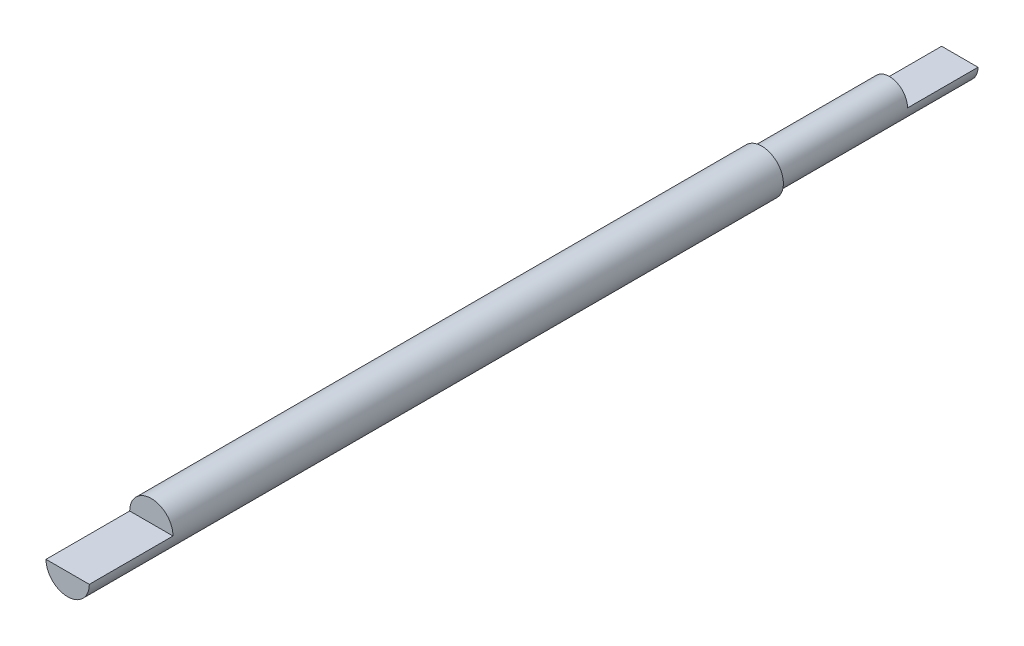
ISO-10303-21;
HEADER;
FILE_DESCRIPTION(('STEP AP214'),'2;1');
FILE_NAME('part.step','',(''),(''),'','','');
FILE_SCHEMA(('AUTOMOTIVE_DESIGN { 1 0 10303 214 1 1 1 1 }'));
ENDSEC;
DATA;
#1=APPLICATION_CONTEXT('core data for automotive mechanical design processes');
#2=APPLICATION_PROTOCOL_DEFINITION('international standard','automotive_design',2000,#1);
#3=PRODUCT_CONTEXT('',#1,'mechanical');
#4=PRODUCT('Part','Part','',(#3));
#5=PRODUCT_RELATED_PRODUCT_CATEGORY('part','',(#4));
#6=PRODUCT_DEFINITION_FORMATION('','',#4);
#7=PRODUCT_DEFINITION_CONTEXT('part definition',#1,'design');
#8=PRODUCT_DEFINITION('design','',#6,#7);
#9=PRODUCT_DEFINITION_SHAPE('','',#8);
#10=(LENGTH_UNIT() NAMED_UNIT(*) SI_UNIT(.MILLI.,.METRE.));
#11=(NAMED_UNIT(*) PLANE_ANGLE_UNIT() SI_UNIT($,.RADIAN.));
#12=(NAMED_UNIT(*) SI_UNIT($,.STERADIAN.) SOLID_ANGLE_UNIT());
#13=UNCERTAINTY_MEASURE_WITH_UNIT(LENGTH_MEASURE(1.E-05),#10,'distance_accuracy_value','');
#14=(GEOMETRIC_REPRESENTATION_CONTEXT(3) GLOBAL_UNCERTAINTY_ASSIGNED_CONTEXT((#13)) GLOBAL_UNIT_ASSIGNED_CONTEXT((#10,
#11,#12)) REPRESENTATION_CONTEXT('',''));
#15=CARTESIAN_POINT('',(0.,0.,0.));
#16=DIRECTION('',(0.,0.,1.));
#17=DIRECTION('',(1.,0.,0.));
#18=AXIS2_PLACEMENT_3D('',#15,#16,#17);
#19=CARTESIAN_POINT('',(0.,0.,196.25));
#20=DIRECTION('',(0.,0.,-1.));
#21=DIRECTION('',(-1.,0.,0.));
#22=AXIS2_PLACEMENT_3D('',#19,#20,#21);
#23=CYLINDRICAL_SURFACE('',#22,4.7625);
#24=CARTESIAN_POINT('',(0.,0.,196.25));
#25=DIRECTION('',(0.,0.,1.));
#26=DIRECTION('',(1.,0.,0.));
#27=AXIS2_PLACEMENT_3D('',#24,#25,#26);
#28=CIRCLE('',#27,4.7625);
#29=CARTESIAN_POINT('',(-4.7625,0.,196.25));
#30=VERTEX_POINT('',#29);
#31=CARTESIAN_POINT('',(4.7625,0.,196.25));
#32=VERTEX_POINT('',#31);
#33=EDGE_CURVE('E11',#30,#32,#28,.T.);
#34=ORIENTED_EDGE('',*,*,#33,.F.);
#35=DIRECTION('',(0.,0.,1.));
#36=VECTOR('',#35,1.);
#37=CARTESIAN_POINT('',(-4.7625,0.,177.84));
#38=LINE('',#37,#36);
#39=CARTESIAN_POINT('',(-4.7625,0.,177.84));
#40=VERTEX_POINT('',#39);
#41=EDGE_CURVE('E57',#40,#30,#38,.T.);
#42=ORIENTED_EDGE('',*,*,#41,.F.);
#43=CARTESIAN_POINT('',(0.,0.,177.84));
#44=DIRECTION('',(0.,0.,1.));
#45=DIRECTION('',(1.,0.,0.));
#46=AXIS2_PLACEMENT_3D('',#43,#44,#45);
#47=CIRCLE('',#46,4.7625);
#48=CARTESIAN_POINT('',(4.7625,0.,177.84));
#49=VERTEX_POINT('',#48);
#50=EDGE_CURVE('E104',#49,#40,#47,.T.);
#51=ORIENTED_EDGE('',*,*,#50,.F.);
#52=DIRECTION('',(0.,0.,1.));
#53=VECTOR('',#52,1.);
#54=CARTESIAN_POINT('',(4.7625,0.,177.84));
#55=LINE('',#54,#53);
#56=EDGE_CURVE('E42',#49,#32,#55,.T.);
#57=ORIENTED_EDGE('',*,*,#56,.T.);
#58=EDGE_LOOP('',(#34,#42,#51,#57));
#59=FACE_BOUND('',#58,.T.);
#60=CARTESIAN_POINT('',(0.,0.,43.57));
#61=DIRECTION('',(0.,0.,-1.));
#62=DIRECTION('',(-1.,0.,0.));
#63=AXIS2_PLACEMENT_3D('',#60,#61,#62);
#64=CIRCLE('',#63,4.7625);
#65=CARTESIAN_POINT('',(-4.7625,0.,43.57));
#66=VERTEX_POINT('',#65);
#67=EDGE_CURVE('E99',#66,#66,#64,.T.);
#68=ORIENTED_EDGE('',*,*,#67,.F.);
#69=EDGE_LOOP('',(#68));
#70=FACE_BOUND('',#69,.T.);
#71=ADVANCED_FACE('F35',(#59,#70),#23,.T.);
#72=CARTESIAN_POINT('',(0.,0.,196.25));
#73=DIRECTION('',(0.,0.,1.));
#74=DIRECTION('',(1.,0.,0.));
#75=AXIS2_PLACEMENT_3D('',#72,#73,#74);
#76=PLANE('',#75);
#77=DIRECTION('',(1.,0.,0.));
#78=VECTOR('',#77,1.);
#79=CARTESIAN_POINT('',(0.,0.,196.25));
#80=LINE('',#79,#78);
#81=EDGE_CURVE('E103',#30,#32,#80,.T.);
#82=ORIENTED_EDGE('',*,*,#81,.F.);
#83=ORIENTED_EDGE('',*,*,#33,.T.);
#84=EDGE_LOOP('',(#82,#83));
#85=FACE_BOUND('',#84,.T.);
#86=ADVANCED_FACE('F116',(#85),#76,.T.);
#87=CARTESIAN_POINT('',(0.,0.,177.84));
#88=DIRECTION('',(0.,-1.,0.));
#89=DIRECTION('',(0.,0.,-1.));
#90=AXIS2_PLACEMENT_3D('',#87,#88,#89);
#91=PLANE('',#90);
#92=ORIENTED_EDGE('',*,*,#81,.T.);
#93=ORIENTED_EDGE('',*,*,#56,.F.);
#94=DIRECTION('',(1.,0.,0.));
#95=VECTOR('',#94,1.);
#96=CARTESIAN_POINT('',(0.,0.,177.84));
#97=LINE('',#96,#95);
#98=EDGE_CURVE('E106',#40,#49,#97,.T.);
#99=ORIENTED_EDGE('',*,*,#98,.F.);
#100=ORIENTED_EDGE('',*,*,#41,.T.);
#101=EDGE_LOOP('',(#92,#93,#99,#100));
#102=FACE_BOUND('',#101,.T.);
#103=ADVANCED_FACE('F117',(#102),#91,.F.);
#104=CARTESIAN_POINT('',(0.,0.,177.84));
#105=DIRECTION('',(0.,0.,1.));
#106=DIRECTION('',(1.,0.,0.));
#107=AXIS2_PLACEMENT_3D('',#104,#105,#106);
#108=PLANE('',#107);
#109=ORIENTED_EDGE('',*,*,#50,.T.);
#110=ORIENTED_EDGE('',*,*,#98,.T.);
#111=EDGE_LOOP('',(#109,#110));
#112=FACE_BOUND('',#111,.T.);
#113=ADVANCED_FACE('F119',(#112),#108,.T.);
#114=CARTESIAN_POINT('',(0.,0.,43.57));
#115=DIRECTION('',(0.,0.,-1.));
#116=DIRECTION('',(-1.,0.,0.));
#117=AXIS2_PLACEMENT_3D('',#114,#115,#116);
#118=PLANE('',#117);
#119=CARTESIAN_POINT('',(0.,0.,43.57));
#120=DIRECTION('',(0.,0.,-1.));
#121=DIRECTION('',(-1.,0.,0.));
#122=AXIS2_PLACEMENT_3D('',#119,#120,#121);
#123=CIRCLE('',#122,4.);
#124=CARTESIAN_POINT('',(-4.,0.,43.57));
#125=VERTEX_POINT('',#124);
#126=EDGE_CURVE('E96',#125,#125,#123,.T.);
#127=ORIENTED_EDGE('',*,*,#126,.F.);
#128=EDGE_LOOP('',(#127));
#129=FACE_BOUND('',#128,.T.);
#130=ORIENTED_EDGE('',*,*,#67,.T.);
#131=EDGE_LOOP('',(#130));
#132=FACE_BOUND('',#131,.T.);
#133=ADVANCED_FACE('F125',(#129,#132),#118,.T.);
#134=CARTESIAN_POINT('',(0.,0.,43.57));
#135=DIRECTION('',(0.,0.,-1.));
#136=DIRECTION('',(-1.,0.,0.));
#137=AXIS2_PLACEMENT_3D('',#134,#135,#136);
#138=CYLINDRICAL_SURFACE('',#137,4.);
#139=DIRECTION('',(0.,0.,-1.));
#140=VECTOR('',#139,1.);
#141=CARTESIAN_POINT('',(-4.,0.,15.5));
#142=LINE('',#141,#140);
#143=CARTESIAN_POINT('',(-4.,0.,15.5));
#144=VERTEX_POINT('',#143);
#145=CARTESIAN_POINT('',(-4.,0.,0.));
#146=VERTEX_POINT('',#145);
#147=EDGE_CURVE('E85',#144,#146,#142,.T.);
#148=ORIENTED_EDGE('',*,*,#147,.T.);
#149=CARTESIAN_POINT('',(0.,0.,0.));
#150=DIRECTION('',(0.,0.,-1.));
#151=DIRECTION('',(-1.,0.,0.));
#152=AXIS2_PLACEMENT_3D('',#149,#150,#151);
#153=CIRCLE('',#152,4.);
#154=CARTESIAN_POINT('',(4.,0.,0.));
#155=VERTEX_POINT('',#154);
#156=EDGE_CURVE('E91',#155,#146,#153,.T.);
#157=ORIENTED_EDGE('',*,*,#156,.F.);
#158=DIRECTION('',(0.,0.,-1.));
#159=VECTOR('',#158,1.);
#160=CARTESIAN_POINT('',(4.,0.,15.5));
#161=LINE('',#160,#159);
#162=CARTESIAN_POINT('',(4.,0.,15.5));
#163=VERTEX_POINT('',#162);
#164=EDGE_CURVE('E49',#163,#155,#161,.T.);
#165=ORIENTED_EDGE('',*,*,#164,.F.);
#166=CARTESIAN_POINT('',(0.,0.,15.5));
#167=DIRECTION('',(0.,0.,-1.));
#168=DIRECTION('',(-1.,0.,0.));
#169=AXIS2_PLACEMENT_3D('',#166,#167,#168);
#170=CIRCLE('',#169,4.);
#171=EDGE_CURVE('E77',#144,#163,#170,.T.);
#172=ORIENTED_EDGE('',*,*,#171,.F.);
#173=EDGE_LOOP('',(#148,#157,#165,#172));
#174=FACE_BOUND('',#173,.T.);
#175=ORIENTED_EDGE('',*,*,#126,.T.);
#176=EDGE_LOOP('',(#175));
#177=FACE_BOUND('',#176,.T.);
#178=ADVANCED_FACE('F88',(#174,#177),#138,.T.);
#179=CARTESIAN_POINT('',(0.,0.,0.));
#180=DIRECTION('',(0.,0.,1.));
#181=DIRECTION('',(1.,0.,0.));
#182=AXIS2_PLACEMENT_3D('',#179,#180,#181);
#183=PLANE('',#182);
#184=ORIENTED_EDGE('',*,*,#156,.T.);
#185=DIRECTION('',(-1.,0.,0.));
#186=VECTOR('',#185,1.);
#187=CARTESIAN_POINT('',(0.,0.,0.));
#188=LINE('',#187,#186);
#189=EDGE_CURVE('E82',#155,#146,#188,.T.);
#190=ORIENTED_EDGE('',*,*,#189,.F.);
#191=EDGE_LOOP('',(#184,#190));
#192=FACE_BOUND('',#191,.T.);
#193=ADVANCED_FACE('F162',(#192),#183,.F.);
#194=CARTESIAN_POINT('',(0.,0.,15.5));
#195=DIRECTION('',(0.,-1.,0.));
#196=DIRECTION('',(0.,0.,-1.));
#197=AXIS2_PLACEMENT_3D('',#194,#195,#196);
#198=PLANE('',#197);
#199=ORIENTED_EDGE('',*,*,#189,.T.);
#200=ORIENTED_EDGE('',*,*,#147,.F.);
#201=DIRECTION('',(-1.,0.,0.));
#202=VECTOR('',#201,1.);
#203=CARTESIAN_POINT('',(0.,0.,15.5));
#204=LINE('',#203,#202);
#205=EDGE_CURVE('E79',#163,#144,#204,.T.);
#206=ORIENTED_EDGE('',*,*,#205,.F.);
#207=ORIENTED_EDGE('',*,*,#164,.T.);
#208=EDGE_LOOP('',(#199,#200,#206,#207));
#209=FACE_BOUND('',#208,.T.);
#210=ADVANCED_FACE('F84',(#209),#198,.F.);
#211=CARTESIAN_POINT('',(0.,0.,15.5));
#212=DIRECTION('',(0.,0.,-1.));
#213=DIRECTION('',(-1.,0.,0.));
#214=AXIS2_PLACEMENT_3D('',#211,#212,#213);
#215=PLANE('',#214);
#216=ORIENTED_EDGE('',*,*,#171,.T.);
#217=ORIENTED_EDGE('',*,*,#205,.T.);
#218=EDGE_LOOP('',(#216,#217));
#219=FACE_BOUND('',#218,.T.);
#220=ADVANCED_FACE('F78',(#219),#215,.T.);
#221=CLOSED_SHELL('',(#71,#86,#103,#113,#133,#178,#193,#210,#220));
#222=MANIFOLD_SOLID_BREP('B2',#221);
#223=ADVANCED_BREP_SHAPE_REPRESENTATION('',(#18,#222),#14);
#224=SHAPE_DEFINITION_REPRESENTATION(#9,#223);
ENDSEC;
END-ISO-10303-21;
